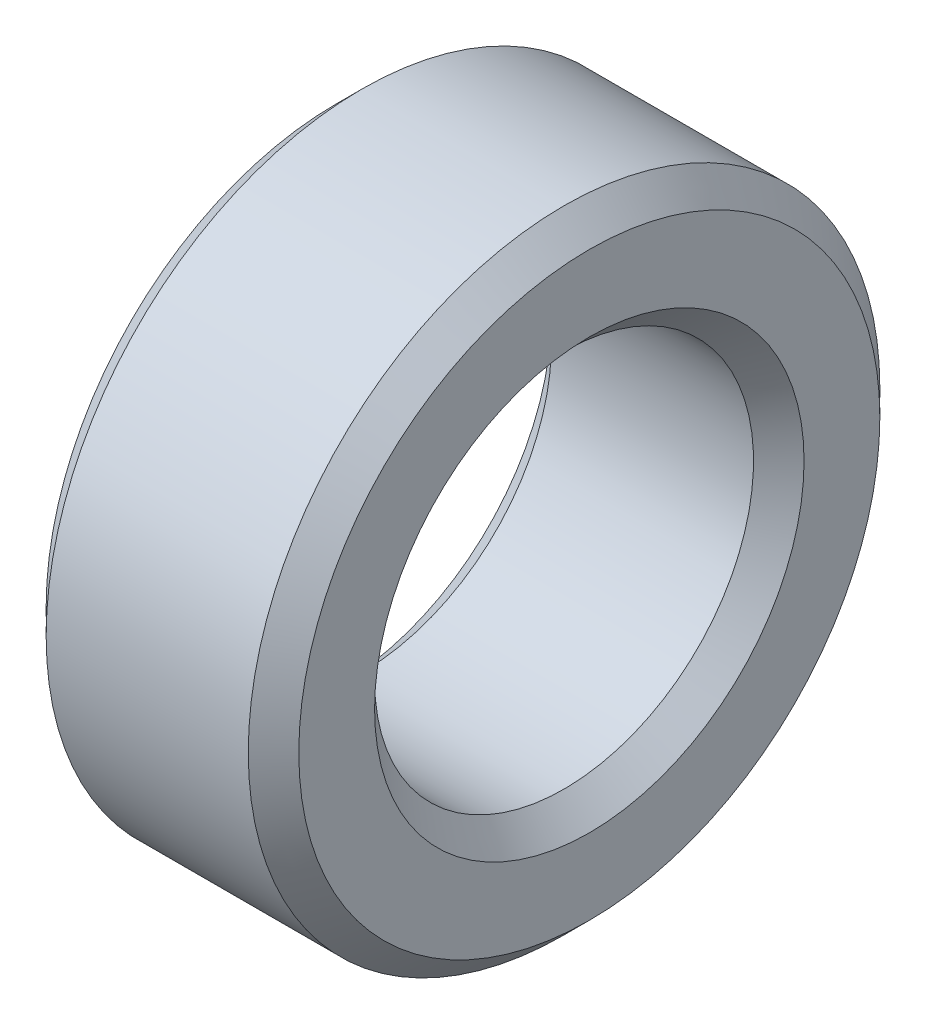
ISO-10303-21;
HEADER;
FILE_DESCRIPTION(('STEP AP214'),'2;1');
FILE_NAME('part.step','',(''),(''),'','','');
FILE_SCHEMA(('AUTOMOTIVE_DESIGN { 1 0 10303 214 1 1 1 1 }'));
ENDSEC;
DATA;
#1=APPLICATION_CONTEXT('core data for automotive mechanical design processes');
#2=APPLICATION_PROTOCOL_DEFINITION('international standard','automotive_design',2000,#1);
#3=PRODUCT_CONTEXT('',#1,'mechanical');
#4=PRODUCT('Part','Part','',(#3));
#5=PRODUCT_RELATED_PRODUCT_CATEGORY('part','',(#4));
#6=PRODUCT_DEFINITION_FORMATION('','',#4);
#7=PRODUCT_DEFINITION_CONTEXT('part definition',#1,'design');
#8=PRODUCT_DEFINITION('design','',#6,#7);
#9=PRODUCT_DEFINITION_SHAPE('','',#8);
#10=(LENGTH_UNIT() NAMED_UNIT(*) SI_UNIT(.MILLI.,.METRE.));
#11=(NAMED_UNIT(*) PLANE_ANGLE_UNIT() SI_UNIT($,.RADIAN.));
#12=(NAMED_UNIT(*) SI_UNIT($,.STERADIAN.) SOLID_ANGLE_UNIT());
#13=UNCERTAINTY_MEASURE_WITH_UNIT(LENGTH_MEASURE(1.E-05),#10,'distance_accuracy_value','');
#14=(GEOMETRIC_REPRESENTATION_CONTEXT(3) GLOBAL_UNCERTAINTY_ASSIGNED_CONTEXT((#13)) GLOBAL_UNIT_ASSIGNED_CONTEXT((#10,
#11,#12)) REPRESENTATION_CONTEXT('',''));
#15=CARTESIAN_POINT('',(0.,0.,0.));
#16=DIRECTION('',(0.,0.,1.));
#17=DIRECTION('',(1.,0.,0.));
#18=AXIS2_PLACEMENT_3D('',#15,#16,#17);
#19=CARTESIAN_POINT('',(0.,1.5,0.));
#20=DIRECTION('',(1.,0.,0.));
#21=DIRECTION('',(0.,0.,-1.));
#22=AXIS2_PLACEMENT_3D('',#19,#20,#21);
#23=PLANE('',#22);
#24=CARTESIAN_POINT('',(0.,0.,0.));
#25=DIRECTION('',(1.,0.,0.));
#26=DIRECTION('',(0.,0.,-1.));
#27=AXIS2_PLACEMENT_3D('',#24,#25,#26);
#28=CIRCLE('',#27,1.7);
#29=CARTESIAN_POINT('',(0.,0.,1.7));
#30=VERTEX_POINT('',#29);
#31=EDGE_CURVE('E66',#30,#30,#28,.T.);
#32=ORIENTED_EDGE('',*,*,#31,.T.);
#33=EDGE_LOOP('',(#32));
#34=FACE_BOUND('',#33,.T.);
#35=CARTESIAN_POINT('',(0.,0.,0.));
#36=DIRECTION('',(1.,0.,0.));
#37=DIRECTION('',(0.,0.,-1.));
#38=AXIS2_PLACEMENT_3D('',#35,#36,#37);
#39=CIRCLE('',#38,2.3);
#40=CARTESIAN_POINT('',(0.,0.,-2.3));
#41=VERTEX_POINT('',#40);
#42=EDGE_CURVE('E70',#41,#41,#39,.F.);
#43=ORIENTED_EDGE('',*,*,#42,.T.);
#44=EDGE_LOOP('',(#43));
#45=FACE_BOUND('',#44,.T.);
#46=ADVANCED_FACE('F40',(#34,#45),#23,.F.);
#47=CARTESIAN_POINT('',(0.,0.,0.));
#48=DIRECTION('',(-1.,0.,0.));
#49=DIRECTION('',(0.,0.,1.));
#50=AXIS2_PLACEMENT_3D('',#47,#48,#49);
#51=CYLINDRICAL_SURFACE('',#50,2.5);
#52=CARTESIAN_POINT('',(0.200000000000001,0.,0.));
#53=DIRECTION('',(1.,0.,0.));
#54=DIRECTION('',(0.,0.,-1.));
#55=AXIS2_PLACEMENT_3D('',#52,#53,#54);
#56=CIRCLE('',#55,2.5);
#57=CARTESIAN_POINT('',(0.200000000000001,0.,-2.5));
#58=VERTEX_POINT('',#57);
#59=EDGE_CURVE('E54',#58,#58,#56,.T.);
#60=ORIENTED_EDGE('',*,*,#59,.T.);
#61=EDGE_LOOP('',(#60));
#62=FACE_BOUND('',#61,.T.);
#63=CARTESIAN_POINT('',(1.8,0.,0.));
#64=DIRECTION('',(-1.,0.,0.));
#65=DIRECTION('',(0.,0.,1.));
#66=AXIS2_PLACEMENT_3D('',#63,#64,#65);
#67=CIRCLE('',#66,2.5);
#68=CARTESIAN_POINT('',(1.8,0.,2.5));
#69=VERTEX_POINT('',#68);
#70=EDGE_CURVE('E60',#69,#69,#67,.T.);
#71=ORIENTED_EDGE('',*,*,#70,.T.);
#72=EDGE_LOOP('',(#71));
#73=FACE_BOUND('',#72,.T.);
#74=ADVANCED_FACE('F99',(#62,#73),#51,.T.);
#75=CARTESIAN_POINT('',(2.,1.5,0.));
#76=DIRECTION('',(-1.,0.,0.));
#77=DIRECTION('',(0.,0.,1.));
#78=AXIS2_PLACEMENT_3D('',#75,#76,#77);
#79=PLANE('',#78);
#80=CARTESIAN_POINT('',(2.,0.,0.));
#81=DIRECTION('',(-1.,0.,0.));
#82=DIRECTION('',(0.,0.,1.));
#83=AXIS2_PLACEMENT_3D('',#80,#81,#82);
#84=CIRCLE('',#83,1.7);
#85=CARTESIAN_POINT('',(2.,0.,1.7));
#86=VERTEX_POINT('',#85);
#87=EDGE_CURVE('E10',#86,#86,#84,.T.);
#88=ORIENTED_EDGE('',*,*,#87,.T.);
#89=EDGE_LOOP('',(#88));
#90=FACE_BOUND('',#89,.T.);
#91=CARTESIAN_POINT('',(2.,0.,0.));
#92=DIRECTION('',(-1.,0.,0.));
#93=DIRECTION('',(0.,0.,1.));
#94=AXIS2_PLACEMENT_3D('',#91,#92,#93);
#95=CIRCLE('',#94,2.3);
#96=CARTESIAN_POINT('',(2.,0.,2.3));
#97=VERTEX_POINT('',#96);
#98=EDGE_CURVE('E48',#97,#97,#95,.F.);
#99=ORIENTED_EDGE('',*,*,#98,.T.);
#100=EDGE_LOOP('',(#99));
#101=FACE_BOUND('',#100,.T.);
#102=ADVANCED_FACE('F105',(#90,#101),#79,.F.);
#103=CARTESIAN_POINT('',(0.,0.,0.));
#104=DIRECTION('',(-1.,0.,0.));
#105=DIRECTION('',(0.,0.,1.));
#106=AXIS2_PLACEMENT_3D('',#103,#104,#105);
#107=CYLINDRICAL_SURFACE('',#106,1.5);
#108=CARTESIAN_POINT('',(0.2,0.,0.));
#109=DIRECTION('',(1.,0.,0.));
#110=DIRECTION('',(0.,0.,-1.));
#111=AXIS2_PLACEMENT_3D('',#108,#109,#110);
#112=CIRCLE('',#111,1.5);
#113=CARTESIAN_POINT('',(0.2,0.,1.5));
#114=VERTEX_POINT('',#113);
#115=EDGE_CURVE('E74',#114,#114,#112,.F.);
#116=ORIENTED_EDGE('',*,*,#115,.T.);
#117=EDGE_LOOP('',(#116));
#118=FACE_BOUND('',#117,.T.);
#119=CARTESIAN_POINT('',(1.8,0.,0.));
#120=DIRECTION('',(-1.,0.,0.));
#121=DIRECTION('',(0.,0.,1.));
#122=AXIS2_PLACEMENT_3D('',#119,#120,#121);
#123=CIRCLE('',#122,1.5);
#124=CARTESIAN_POINT('',(1.8,0.,1.5));
#125=VERTEX_POINT('',#124);
#126=EDGE_CURVE('E78',#125,#125,#123,.F.);
#127=ORIENTED_EDGE('',*,*,#126,.T.);
#128=EDGE_LOOP('',(#127));
#129=FACE_BOUND('',#128,.T.);
#130=ADVANCED_FACE('F84',(#118,#129),#107,.F.);
#131=CARTESIAN_POINT('',(0.2,0.,0.));
#132=DIRECTION('',(-1.,0.,0.));
#133=DIRECTION('',(0.,0.,1.));
#134=AXIS2_PLACEMENT_3D('',#131,#132,#133);
#135=CONICAL_SURFACE('',#134,1.5,0.785398163397451);
#136=CARTESIAN_POINT('',(0.,0.,1.7));
#137=CARTESIAN_POINT('',(0.00208333333333327,0.,1.69791666666667));
#138=CARTESIAN_POINT('',(0.00416666666666662,0.,1.69583333333333));
#139=CARTESIAN_POINT('',(0.00833333333333331,0.,1.69166666666667));
#140=CARTESIAN_POINT('',(0.0104166666666667,0.,1.68958333333333));
#141=CARTESIAN_POINT('',(0.0145833333333333,0.,1.68541666666667));
#142=CARTESIAN_POINT('',(0.0166666666666666,0.,1.68333333333333));
#143=CARTESIAN_POINT('',(0.0208333333333333,0.,1.67916666666667));
#144=CARTESIAN_POINT('',(0.0229166666666666,0.,1.67708333333333));
#145=CARTESIAN_POINT('',(0.0270833333333333,0.,1.67291666666667));
#146=CARTESIAN_POINT('',(0.0291666666666666,0.,1.67083333333333));
#147=CARTESIAN_POINT('',(0.0333333333333333,0.,1.66666666666667));
#148=CARTESIAN_POINT('',(0.0354166666666666,0.,1.66458333333333));
#149=CARTESIAN_POINT('',(0.0395833333333333,0.,1.66041666666667));
#150=CARTESIAN_POINT('',(0.0416666666666666,0.,1.65833333333333));
#151=CARTESIAN_POINT('',(0.0458333333333333,0.,1.65416666666667));
#152=CARTESIAN_POINT('',(0.0479166666666666,0.,1.65208333333333));
#153=CARTESIAN_POINT('',(0.0520833333333333,0.,1.64791666666667));
#154=CARTESIAN_POINT('',(0.0541666666666666,0.,1.64583333333333));
#155=CARTESIAN_POINT('',(0.0583333333333333,0.,1.64166666666667));
#156=CARTESIAN_POINT('',(0.0604166666666666,0.,1.63958333333333));
#157=CARTESIAN_POINT('',(0.0645833333333333,0.,1.63541666666667));
#158=CARTESIAN_POINT('',(0.0666666666666666,0.,1.63333333333333));
#159=CARTESIAN_POINT('',(0.0708333333333333,0.,1.62916666666667));
#160=CARTESIAN_POINT('',(0.0729166666666666,0.,1.62708333333333));
#161=CARTESIAN_POINT('',(0.0770833333333333,0.,1.62291666666667));
#162=CARTESIAN_POINT('',(0.0791666666666666,0.,1.62083333333333));
#163=CARTESIAN_POINT('',(0.0833333333333333,0.,1.61666666666667));
#164=CARTESIAN_POINT('',(0.0854166666666666,0.,1.61458333333333));
#165=CARTESIAN_POINT('',(0.0895833333333333,0.,1.61041666666667));
#166=CARTESIAN_POINT('',(0.0916666666666666,0.,1.60833333333333));
#167=CARTESIAN_POINT('',(0.0958333333333333,0.,1.60416666666667));
#168=CARTESIAN_POINT('',(0.0979166666666666,0.,1.60208333333333));
#169=CARTESIAN_POINT('',(0.102083333333333,0.,1.59791666666667));
#170=CARTESIAN_POINT('',(0.104166666666667,0.,1.59583333333333));
#171=CARTESIAN_POINT('',(0.108333333333333,0.,1.59166666666667));
#172=CARTESIAN_POINT('',(0.110416666666667,0.,1.58958333333333));
#173=CARTESIAN_POINT('',(0.114583333333333,0.,1.58541666666667));
#174=CARTESIAN_POINT('',(0.116666666666667,0.,1.58333333333333));
#175=CARTESIAN_POINT('',(0.120833333333333,0.,1.57916666666667));
#176=CARTESIAN_POINT('',(0.122916666666667,0.,1.57708333333333));
#177=CARTESIAN_POINT('',(0.127083333333333,0.,1.57291666666667));
#178=CARTESIAN_POINT('',(0.129166666666667,0.,1.57083333333333));
#179=CARTESIAN_POINT('',(0.133333333333333,0.,1.56666666666667));
#180=CARTESIAN_POINT('',(0.135416666666667,0.,1.56458333333333));
#181=CARTESIAN_POINT('',(0.139583333333333,0.,1.56041666666667));
#182=CARTESIAN_POINT('',(0.141666666666667,0.,1.55833333333333));
#183=CARTESIAN_POINT('',(0.145833333333333,0.,1.55416666666667));
#184=CARTESIAN_POINT('',(0.147916666666667,0.,1.55208333333333));
#185=CARTESIAN_POINT('',(0.152083333333333,0.,1.54791666666667));
#186=CARTESIAN_POINT('',(0.154166666666667,0.,1.54583333333333));
#187=CARTESIAN_POINT('',(0.158333333333333,0.,1.54166666666667));
#188=CARTESIAN_POINT('',(0.160416666666667,0.,1.53958333333333));
#189=CARTESIAN_POINT('',(0.164583333333333,0.,1.53541666666667));
#190=CARTESIAN_POINT('',(0.166666666666667,0.,1.53333333333333));
#191=CARTESIAN_POINT('',(0.170833333333333,0.,1.52916666666667));
#192=CARTESIAN_POINT('',(0.172916666666667,0.,1.52708333333333));
#193=CARTESIAN_POINT('',(0.177083333333333,0.,1.52291666666667));
#194=CARTESIAN_POINT('',(0.179166666666667,0.,1.52083333333333));
#195=CARTESIAN_POINT('',(0.183333333333333,0.,1.51666666666667));
#196=CARTESIAN_POINT('',(0.185416666666667,0.,1.51458333333333));
#197=CARTESIAN_POINT('',(0.189583333333333,0.,1.51041666666667));
#198=CARTESIAN_POINT('',(0.191666666666667,0.,1.50833333333333));
#199=CARTESIAN_POINT('',(0.195833333333333,0.,1.50416666666667));
#200=CARTESIAN_POINT('',(0.197916666666666,0.,1.50208333333333));
#201=CARTESIAN_POINT('',(0.2,0.,1.5));
#202=B_SPLINE_CURVE_WITH_KNOTS('',3,(#136,#137,#138,#139,#140,#141,#142,#143,#144,#145,#146,
#147,#148,#149,#150,#151,#152,#153,#154,#155,#156,#157,#158,#159,#160,#161,#162,#163,#164,#165,
#166,#167,#168,#169,#170,#171,#172,#173,#174,#175,#176,#177,#178,#179,#180,#181,#182,#183,#184,
#185,#186,#187,#188,#189,#190,#191,#192,#193,#194,#195,#196,#197,#198,#199,#200,#201),
.UNSPECIFIED.,.F.,.F.,(4,2,2,2,2,2,2,2,2,2,2,2,2,2,2,2,2,2,2,2,2,2,2,2,2,2,2,2,2,2,2,2,4),(0.,
0.00883883476483181,0.0176776695296636,0.0265165042944956,0.0353553390593274,0.0441941738241592,
0.0530330085889912,0.061871843353823,0.0707106781186548,0.0795495128834868,0.0883883476483186,
0.0972271824131504,0.106066017177982,0.114904851942814,0.123743686707646,0.132582521472478,
0.14142135623731,0.150260191002142,0.159099025766973,0.167937860531805,0.176776695296637,
0.185615530061469,0.194454364826301,0.203293199591133,0.212132034355965,0.220970869120797,
0.229809703885628,0.23864853865046,0.247487373415292,0.256326208180124,0.265165042944956,
0.274003877709788,0.28284271247462),.UNSPECIFIED.);
#203=EDGE_CURVE('BSEAM95',#30,#114,#202,.T.);
#204=ORIENTED_EDGE('',*,*,#31,.F.);
#205=ORIENTED_EDGE('',*,*,#115,.F.);
#206=ORIENTED_EDGE('',*,*,#203,.T.);
#207=ORIENTED_EDGE('',*,*,#203,.F.);
#208=EDGE_LOOP('',(#204,#206,#205,#207));
#209=FACE_BOUND('',#208,.T.);
#210=ADVANCED_FACE('F95',(#209),#135,.F.);
#211=CARTESIAN_POINT('',(0.,0.,0.));
#212=DIRECTION('',(1.,0.,0.));
#213=DIRECTION('',(0.,0.,-1.));
#214=AXIS2_PLACEMENT_3D('',#211,#212,#213);
#215=CONICAL_SURFACE('',#214,2.3,0.785398163397445);
#216=ORIENTED_EDGE('',*,*,#59,.F.);
#217=EDGE_LOOP('',(#216));
#218=FACE_BOUND('',#217,.T.);
#219=ORIENTED_EDGE('',*,*,#42,.F.);
#220=EDGE_LOOP('',(#219));
#221=FACE_BOUND('',#220,.T.);
#222=ADVANCED_FACE('F89',(#218,#221),#215,.T.);
#223=CARTESIAN_POINT('',(2.,0.,0.));
#224=DIRECTION('',(1.,0.,0.));
#225=DIRECTION('',(0.,0.,-1.));
#226=AXIS2_PLACEMENT_3D('',#223,#224,#225);
#227=CONICAL_SURFACE('',#226,1.7,0.785398163397446);
#228=ORIENTED_EDGE('',*,*,#126,.F.);
#229=EDGE_LOOP('',(#228));
#230=FACE_BOUND('',#229,.T.);
#231=ORIENTED_EDGE('',*,*,#87,.F.);
#232=EDGE_LOOP('',(#231));
#233=FACE_BOUND('',#232,.T.);
#234=ADVANCED_FACE('F86',(#230,#233),#227,.F.);
#235=CARTESIAN_POINT('',(1.8,0.,0.));
#236=DIRECTION('',(-1.,0.,0.));
#237=DIRECTION('',(0.,0.,1.));
#238=AXIS2_PLACEMENT_3D('',#235,#236,#237);
#239=CONICAL_SURFACE('',#238,2.5,0.785398163397452);
#240=ORIENTED_EDGE('',*,*,#98,.F.);
#241=EDGE_LOOP('',(#240));
#242=FACE_BOUND('',#241,.T.);
#243=ORIENTED_EDGE('',*,*,#70,.F.);
#244=EDGE_LOOP('',(#243));
#245=FACE_BOUND('',#244,.T.);
#246=ADVANCED_FACE('F42',(#242,#245),#239,.T.);
#247=CLOSED_SHELL('',(#46,#74,#102,#130,#210,#222,#234,#246));
#248=MANIFOLD_SOLID_BREP('B2',#247);
#249=ADVANCED_BREP_SHAPE_REPRESENTATION('',(#18,#248),#14);
#250=SHAPE_DEFINITION_REPRESENTATION(#9,#249);
ENDSEC;
END-ISO-10303-21;
